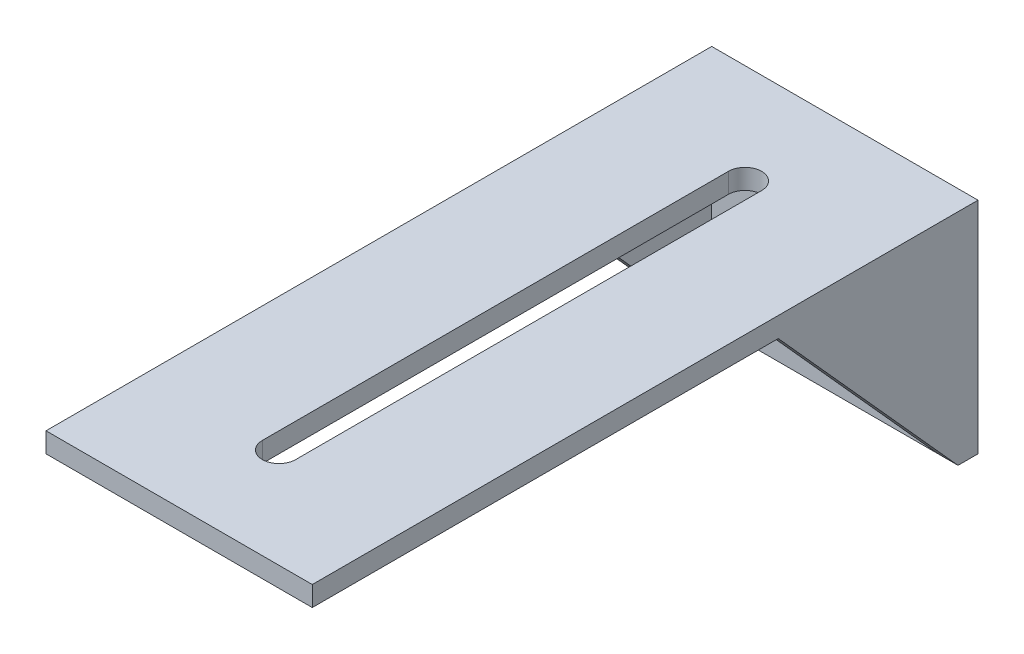
ISO-10303-21;
HEADER;
FILE_DESCRIPTION(('STEP AP214'),'2;1');
FILE_NAME('part.step','',(''),(''),'','','');
FILE_SCHEMA(('AUTOMOTIVE_DESIGN { 1 0 10303 214 1 1 1 1 }'));
ENDSEC;
DATA;
#1=APPLICATION_CONTEXT('core data for automotive mechanical design processes');
#2=APPLICATION_PROTOCOL_DEFINITION('international standard','automotive_design',2000,#1);
#3=PRODUCT_CONTEXT('',#1,'mechanical');
#4=PRODUCT('Part','Part','',(#3));
#5=PRODUCT_RELATED_PRODUCT_CATEGORY('part','',(#4));
#6=PRODUCT_DEFINITION_FORMATION('','',#4);
#7=PRODUCT_DEFINITION_CONTEXT('part definition',#1,'design');
#8=PRODUCT_DEFINITION('design','',#6,#7);
#9=PRODUCT_DEFINITION_SHAPE('','',#8);
#10=(LENGTH_UNIT() NAMED_UNIT(*) SI_UNIT(.MILLI.,.METRE.));
#11=(NAMED_UNIT(*) PLANE_ANGLE_UNIT() SI_UNIT($,.RADIAN.));
#12=(NAMED_UNIT(*) SI_UNIT($,.STERADIAN.) SOLID_ANGLE_UNIT());
#13=UNCERTAINTY_MEASURE_WITH_UNIT(LENGTH_MEASURE(1.E-05),#10,'distance_accuracy_value','');
#14=(GEOMETRIC_REPRESENTATION_CONTEXT(3) GLOBAL_UNCERTAINTY_ASSIGNED_CONTEXT((#13)) GLOBAL_UNIT_ASSIGNED_CONTEXT((#10,
#11,#12)) REPRESENTATION_CONTEXT('',''));
#15=CARTESIAN_POINT('',(0.,0.,0.));
#16=DIRECTION('',(0.,0.,1.));
#17=DIRECTION('',(1.,0.,0.));
#18=AXIS2_PLACEMENT_3D('',#15,#16,#17);
#19=CARTESIAN_POINT('',(0.,3.,0.));
#20=DIRECTION('',(1.,0.,0.));
#21=DIRECTION('',(0.,0.,-1.));
#22=AXIS2_PLACEMENT_3D('',#19,#20,#21);
#23=PLANE('',#22);
#24=DIRECTION('',(0.,-0.743294146247166,-0.66896473162245));
#25=VECTOR('',#24,1.);
#26=CARTESIAN_POINT('',(0.,-13.2596685082873,18.0662983425414));
#27=LINE('',#26,#25);
#28=CARTESIAN_POINT('',(0.,0.,30.));
#29=VERTEX_POINT('',#28);
#30=CARTESIAN_POINT('',(0.,-30.,3.));
#31=VERTEX_POINT('',#30);
#32=EDGE_CURVE('E156',#29,#31,#27,.T.);
#33=ORIENTED_EDGE('',*,*,#32,.F.);
#34=DIRECTION('',(0.,0.,1.));
#35=VECTOR('',#34,1.);
#36=CARTESIAN_POINT('',(0.,0.,0.));
#37=LINE('',#36,#35);
#38=CARTESIAN_POINT('',(0.,0.,100.));
#39=VERTEX_POINT('',#38);
#40=EDGE_CURVE('E200',#29,#39,#37,.T.);
#41=ORIENTED_EDGE('',*,*,#40,.T.);
#42=DIRECTION('',(0.,-1.,0.));
#43=VECTOR('',#42,1.);
#44=CARTESIAN_POINT('',(0.,3.,100.));
#45=LINE('',#44,#43);
#46=CARTESIAN_POINT('',(0.,3.,100.));
#47=VERTEX_POINT('',#46);
#48=EDGE_CURVE('E225',#47,#39,#45,.T.);
#49=ORIENTED_EDGE('',*,*,#48,.F.);
#50=DIRECTION('',(0.,0.,1.));
#51=VECTOR('',#50,1.);
#52=CARTESIAN_POINT('',(0.,3.,0.));
#53=LINE('',#52,#51);
#54=CARTESIAN_POINT('',(0.,3.,0.));
#55=VERTEX_POINT('',#54);
#56=EDGE_CURVE('E201',#55,#47,#53,.T.);
#57=ORIENTED_EDGE('',*,*,#56,.F.);
#58=DIRECTION('',(0.,-1.,0.));
#59=VECTOR('',#58,1.);
#60=CARTESIAN_POINT('',(0.,3.,0.));
#61=LINE('',#60,#59);
#62=CARTESIAN_POINT('',(0.,-30.,0.));
#63=VERTEX_POINT('',#62);
#64=EDGE_CURVE('E209',#55,#63,#61,.T.);
#65=ORIENTED_EDGE('',*,*,#64,.T.);
#66=DIRECTION('',(0.,0.,-1.));
#67=VECTOR('',#66,1.);
#68=CARTESIAN_POINT('',(0.,-30.,0.));
#69=LINE('',#68,#67);
#70=EDGE_CURVE('E167',#31,#63,#69,.T.);
#71=ORIENTED_EDGE('',*,*,#70,.F.);
#72=EDGE_LOOP('',(#33,#41,#49,#57,#65,#71));
#73=FACE_BOUND('',#72,.T.);
#74=ADVANCED_FACE('F33',(#73),#23,.F.);
#75=CARTESIAN_POINT('',(40.,3.,0.));
#76=DIRECTION('',(-1.,0.,0.));
#77=DIRECTION('',(0.,0.,1.));
#78=AXIS2_PLACEMENT_3D('',#75,#76,#77);
#79=PLANE('',#78);
#80=DIRECTION('',(0.,0.743294146247166,0.66896473162245));
#81=VECTOR('',#80,1.);
#82=CARTESIAN_POINT('',(40.,-13.2596685082873,18.0662983425414));
#83=LINE('',#82,#81);
#84=CARTESIAN_POINT('',(40.,-30.,3.));
#85=VERTEX_POINT('',#84);
#86=CARTESIAN_POINT('',(40.,0.,30.));
#87=VERTEX_POINT('',#86);
#88=EDGE_CURVE('E138',#85,#87,#83,.T.);
#89=ORIENTED_EDGE('',*,*,#88,.F.);
#90=DIRECTION('',(0.,0.,1.));
#91=VECTOR('',#90,1.);
#92=CARTESIAN_POINT('',(40.,-30.,0.));
#93=LINE('',#92,#91);
#94=CARTESIAN_POINT('',(40.,-30.,0.));
#95=VERTEX_POINT('',#94);
#96=EDGE_CURVE('E152',#95,#85,#93,.T.);
#97=ORIENTED_EDGE('',*,*,#96,.F.);
#98=DIRECTION('',(0.,-1.,0.));
#99=VECTOR('',#98,1.);
#100=CARTESIAN_POINT('',(40.,3.,0.));
#101=LINE('',#100,#99);
#102=CARTESIAN_POINT('',(40.,3.,0.));
#103=VERTEX_POINT('',#102);
#104=EDGE_CURVE('E234',#103,#95,#101,.T.);
#105=ORIENTED_EDGE('',*,*,#104,.F.);
#106=DIRECTION('',(0.,0.,-1.));
#107=VECTOR('',#106,1.);
#108=CARTESIAN_POINT('',(40.,3.,0.));
#109=LINE('',#108,#107);
#110=CARTESIAN_POINT('',(40.,3.,100.));
#111=VERTEX_POINT('',#110);
#112=EDGE_CURVE('E205',#111,#103,#109,.T.);
#113=ORIENTED_EDGE('',*,*,#112,.F.);
#114=DIRECTION('',(0.,-1.,0.));
#115=VECTOR('',#114,1.);
#116=CARTESIAN_POINT('',(40.,3.,100.));
#117=LINE('',#116,#115);
#118=CARTESIAN_POINT('',(40.,0.,100.));
#119=VERTEX_POINT('',#118);
#120=EDGE_CURVE('E235',#111,#119,#117,.T.);
#121=ORIENTED_EDGE('',*,*,#120,.T.);
#122=DIRECTION('',(0.,0.,-1.));
#123=VECTOR('',#122,1.);
#124=CARTESIAN_POINT('',(40.,0.,0.));
#125=LINE('',#124,#123);
#126=EDGE_CURVE('E155',#119,#87,#125,.T.);
#127=ORIENTED_EDGE('',*,*,#126,.T.);
#128=EDGE_LOOP('',(#89,#97,#105,#113,#121,#127));
#129=FACE_BOUND('',#128,.T.);
#130=ADVANCED_FACE('F150',(#129),#79,.F.);
#131=CARTESIAN_POINT('',(0.,-30.,0.));
#132=DIRECTION('',(0.,1.,0.));
#133=DIRECTION('',(0.,0.,1.));
#134=AXIS2_PLACEMENT_3D('',#131,#132,#133);
#135=PLANE('',#134);
#136=DIRECTION('',(-1.,0.,0.));
#137=VECTOR('',#136,1.);
#138=CARTESIAN_POINT('',(53.,-30.,3.));
#139=LINE('',#138,#137);
#140=CARTESIAN_POINT('',(3.,-30.,3.));
#141=VERTEX_POINT('',#140);
#142=EDGE_CURVE('E145',#141,#31,#139,.T.);
#143=ORIENTED_EDGE('',*,*,#142,.T.);
#144=ORIENTED_EDGE('',*,*,#70,.T.);
#145=DIRECTION('',(1.,0.,0.));
#146=VECTOR('',#145,1.);
#147=CARTESIAN_POINT('',(0.,-30.,0.));
#148=LINE('',#147,#146);
#149=EDGE_CURVE('E161',#63,#95,#148,.T.);
#150=ORIENTED_EDGE('',*,*,#149,.T.);
#151=ORIENTED_EDGE('',*,*,#96,.T.);
#152=CARTESIAN_POINT('',(37.,-30.,3.));
#153=VERTEX_POINT('',#152);
#154=EDGE_CURVE('E135',#85,#153,#139,.T.);
#155=ORIENTED_EDGE('',*,*,#154,.T.);
#156=DIRECTION('',(-1.,0.,0.));
#157=VECTOR('',#156,1.);
#158=CARTESIAN_POINT('',(0.,-30.,3.));
#159=LINE('',#158,#157);
#160=EDGE_CURVE('E163',#153,#141,#159,.T.);
#161=ORIENTED_EDGE('',*,*,#160,.T.);
#162=EDGE_LOOP('',(#143,#144,#150,#151,#155,#161));
#163=FACE_BOUND('',#162,.T.);
#164=ADVANCED_FACE('F159',(#163),#135,.F.);
#165=CARTESIAN_POINT('',(3.,-30.,30.));
#166=DIRECTION('',(1.,0.,0.));
#167=DIRECTION('',(0.,1.,0.));
#168=AXIS2_PLACEMENT_3D('',#165,#166,#167);
#169=PLANE('',#168);
#170=DIRECTION('',(0.,0.,-1.));
#171=VECTOR('',#170,1.);
#172=CARTESIAN_POINT('',(3.,0.,0.));
#173=LINE('',#172,#171);
#174=CARTESIAN_POINT('',(3.,0.,30.));
#175=VERTEX_POINT('',#174);
#176=CARTESIAN_POINT('',(3.,0.,7.99999999999999));
#177=VERTEX_POINT('',#176);
#178=EDGE_CURVE('E254',#175,#177,#173,.T.);
#179=ORIENTED_EDGE('',*,*,#178,.F.);
#180=DIRECTION('',(0.,-0.743294146247166,-0.66896473162245));
#181=VECTOR('',#180,1.);
#182=CARTESIAN_POINT('',(3.,-16.5745856353591,15.0828729281768));
#183=LINE('',#182,#181);
#184=EDGE_CURVE('E144',#175,#141,#183,.T.);
#185=ORIENTED_EDGE('',*,*,#184,.T.);
#186=DIRECTION('',(0.,-1.,0.));
#187=VECTOR('',#186,1.);
#188=CARTESIAN_POINT('',(3.,-30.,3.));
#189=LINE('',#188,#187);
#190=CARTESIAN_POINT('',(3.,-5.00000000000003,3.));
#191=VERTEX_POINT('',#190);
#192=EDGE_CURVE('E252',#191,#141,#189,.T.);
#193=ORIENTED_EDGE('',*,*,#192,.F.);
#194=DIRECTION('',(0.,0.707106781186551,0.707106781186545));
#195=VECTOR('',#194,1.);
#196=CARTESIAN_POINT('',(3.,-5.00000000000003,3.));
#197=LINE('',#196,#195);
#198=EDGE_CURVE('E216',#177,#191,#197,.F.);
#199=ORIENTED_EDGE('',*,*,#198,.F.);
#200=EDGE_LOOP('',(#179,#185,#193,#199));
#201=FACE_BOUND('',#200,.T.);
#202=ADVANCED_FACE('F370',(#201),#169,.T.);
#203=CARTESIAN_POINT('',(37.,3.,30.));
#204=DIRECTION('',(-1.,0.,0.));
#205=DIRECTION('',(0.,-1.,0.));
#206=AXIS2_PLACEMENT_3D('',#203,#204,#205);
#207=PLANE('',#206);
#208=DIRECTION('',(0.,1.,0.));
#209=VECTOR('',#208,1.);
#210=CARTESIAN_POINT('',(37.,-30.,3.));
#211=LINE('',#210,#209);
#212=CARTESIAN_POINT('',(37.,-5.00000000000003,3.));
#213=VERTEX_POINT('',#212);
#214=EDGE_CURVE('E256',#153,#213,#211,.T.);
#215=ORIENTED_EDGE('',*,*,#214,.F.);
#216=DIRECTION('',(0.,0.743294146247166,0.66896473162245));
#217=VECTOR('',#216,1.);
#218=CARTESIAN_POINT('',(37.,1.65745856353591,31.4917127071823));
#219=LINE('',#218,#217);
#220=CARTESIAN_POINT('',(37.,0.,30.));
#221=VERTEX_POINT('',#220);
#222=EDGE_CURVE('E11',#153,#221,#219,.T.);
#223=ORIENTED_EDGE('',*,*,#222,.T.);
#224=DIRECTION('',(0.,0.,1.));
#225=VECTOR('',#224,1.);
#226=CARTESIAN_POINT('',(37.,0.,0.));
#227=LINE('',#226,#225);
#228=CARTESIAN_POINT('',(37.,0.,7.99999999999999));
#229=VERTEX_POINT('',#228);
#230=EDGE_CURVE('E47',#229,#221,#227,.T.);
#231=ORIENTED_EDGE('',*,*,#230,.F.);
#232=DIRECTION('',(0.,-0.707106781186551,-0.707106781186545));
#233=VECTOR('',#232,1.);
#234=CARTESIAN_POINT('',(37.,-5.00000000000004,3.));
#235=LINE('',#234,#233);
#236=EDGE_CURVE('E41',#213,#229,#235,.F.);
#237=ORIENTED_EDGE('',*,*,#236,.F.);
#238=EDGE_LOOP('',(#215,#223,#231,#237));
#239=FACE_BOUND('',#238,.T.);
#240=ADVANCED_FACE('F312',(#239),#207,.T.);
#241=CARTESIAN_POINT('',(0.,0.,0.));
#242=DIRECTION('',(0.,1.,0.));
#243=DIRECTION('',(0.,0.,1.));
#244=AXIS2_PLACEMENT_3D('',#241,#242,#243);
#245=PLANE('',#244);
#246=DIRECTION('',(0.,0.,1.));
#247=VECTOR('',#246,1.);
#248=CARTESIAN_POINT('',(17.5,0.,85.));
#249=LINE('',#248,#247);
#250=CARTESIAN_POINT('',(17.5,0.,15.));
#251=VERTEX_POINT('',#250);
#252=CARTESIAN_POINT('',(17.5,0.,85.));
#253=VERTEX_POINT('',#252);
#254=EDGE_CURVE('E174',#251,#253,#249,.T.);
#255=ORIENTED_EDGE('',*,*,#254,.T.);
#256=CARTESIAN_POINT('',(20.,0.,85.));
#257=DIRECTION('',(0.,1.,0.));
#258=DIRECTION('',(0.,0.,1.));
#259=AXIS2_PLACEMENT_3D('',#256,#257,#258);
#260=CIRCLE('',#259,2.5);
#261=CARTESIAN_POINT('',(22.5,0.,85.));
#262=VERTEX_POINT('',#261);
#263=EDGE_CURVE('E165',#253,#262,#260,.T.);
#264=ORIENTED_EDGE('',*,*,#263,.T.);
#265=DIRECTION('',(0.,0.,-1.));
#266=VECTOR('',#265,1.);
#267=CARTESIAN_POINT('',(22.5,0.,85.));
#268=LINE('',#267,#266);
#269=CARTESIAN_POINT('',(22.5,0.,15.));
#270=VERTEX_POINT('',#269);
#271=EDGE_CURVE('E184',#262,#270,#268,.T.);
#272=ORIENTED_EDGE('',*,*,#271,.T.);
#273=CARTESIAN_POINT('',(20.,0.,15.));
#274=DIRECTION('',(0.,1.,0.));
#275=DIRECTION('',(0.,0.,1.));
#276=AXIS2_PLACEMENT_3D('',#273,#274,#275);
#277=CIRCLE('',#276,2.5);
#278=EDGE_CURVE('E186',#270,#251,#277,.T.);
#279=ORIENTED_EDGE('',*,*,#278,.T.);
#280=EDGE_LOOP('',(#255,#264,#272,#279));
#281=FACE_BOUND('',#280,.T.);
#282=DIRECTION('',(-1.,0.,0.));
#283=VECTOR('',#282,1.);
#284=CARTESIAN_POINT('',(0.,0.,30.));
#285=LINE('',#284,#283);
#286=EDGE_CURVE('E261',#175,#29,#285,.T.);
#287=ORIENTED_EDGE('',*,*,#286,.F.);
#288=ORIENTED_EDGE('',*,*,#178,.T.);
#289=DIRECTION('',(1.,0.,0.));
#290=VECTOR('',#289,1.);
#291=CARTESIAN_POINT('',(40.,0.,7.99999999999999));
#292=LINE('',#291,#290);
#293=EDGE_CURVE('E222',#177,#229,#292,.T.);
#294=ORIENTED_EDGE('',*,*,#293,.T.);
#295=ORIENTED_EDGE('',*,*,#230,.T.);
#296=DIRECTION('',(-1.,0.,0.));
#297=VECTOR('',#296,1.);
#298=CARTESIAN_POINT('',(0.,0.,30.));
#299=LINE('',#298,#297);
#300=EDGE_CURVE('E251',#87,#221,#299,.T.);
#301=ORIENTED_EDGE('',*,*,#300,.F.);
#302=ORIENTED_EDGE('',*,*,#126,.F.);
#303=DIRECTION('',(1.,0.,0.));
#304=VECTOR('',#303,1.);
#305=CARTESIAN_POINT('',(0.,0.,100.));
#306=LINE('',#305,#304);
#307=EDGE_CURVE('E212',#39,#119,#306,.T.);
#308=ORIENTED_EDGE('',*,*,#307,.F.);
#309=ORIENTED_EDGE('',*,*,#40,.F.);
#310=EDGE_LOOP('',(#287,#288,#294,#295,#301,#302,#308,#309));
#311=FACE_BOUND('',#310,.T.);
#312=ADVANCED_FACE('F250',(#281,#311),#245,.F.);
#313=CARTESIAN_POINT('',(0.,3.,0.));
#314=DIRECTION('',(0.,1.,0.));
#315=DIRECTION('',(0.,0.,1.));
#316=AXIS2_PLACEMENT_3D('',#313,#314,#315);
#317=PLANE('',#316);
#318=DIRECTION('',(-1.,0.,0.));
#319=VECTOR('',#318,1.);
#320=CARTESIAN_POINT('',(0.,3.,0.));
#321=LINE('',#320,#319);
#322=EDGE_CURVE('E207',#103,#55,#321,.T.);
#323=ORIENTED_EDGE('',*,*,#322,.T.);
#324=ORIENTED_EDGE('',*,*,#56,.T.);
#325=DIRECTION('',(1.,0.,0.));
#326=VECTOR('',#325,1.);
#327=CARTESIAN_POINT('',(0.,3.,100.));
#328=LINE('',#327,#326);
#329=EDGE_CURVE('E203',#47,#111,#328,.T.);
#330=ORIENTED_EDGE('',*,*,#329,.T.);
#331=ORIENTED_EDGE('',*,*,#112,.T.);
#332=EDGE_LOOP('',(#323,#324,#330,#331));
#333=FACE_BOUND('',#332,.T.);
#334=DIRECTION('',(0.,0.,-1.));
#335=VECTOR('',#334,1.);
#336=CARTESIAN_POINT('',(22.5,3.,85.));
#337=LINE('',#336,#335);
#338=CARTESIAN_POINT('',(22.5,3.,85.));
#339=VERTEX_POINT('',#338);
#340=CARTESIAN_POINT('',(22.5,3.,15.));
#341=VERTEX_POINT('',#340);
#342=EDGE_CURVE('E173',#339,#341,#337,.T.);
#343=ORIENTED_EDGE('',*,*,#342,.F.);
#344=CARTESIAN_POINT('',(20.,3.,85.));
#345=DIRECTION('',(0.,1.,0.));
#346=DIRECTION('',(0.,0.,1.));
#347=AXIS2_PLACEMENT_3D('',#344,#345,#346);
#348=CIRCLE('',#347,2.5);
#349=CARTESIAN_POINT('',(17.5,3.,85.));
#350=VERTEX_POINT('',#349);
#351=EDGE_CURVE('E171',#350,#339,#348,.T.);
#352=ORIENTED_EDGE('',*,*,#351,.F.);
#353=DIRECTION('',(0.,0.,1.));
#354=VECTOR('',#353,1.);
#355=CARTESIAN_POINT('',(17.5,3.,85.));
#356=LINE('',#355,#354);
#357=CARTESIAN_POINT('',(17.5,3.,15.));
#358=VERTEX_POINT('',#357);
#359=EDGE_CURVE('E179',#358,#350,#356,.T.);
#360=ORIENTED_EDGE('',*,*,#359,.F.);
#361=CARTESIAN_POINT('',(20.,3.,15.));
#362=DIRECTION('',(0.,1.,0.));
#363=DIRECTION('',(0.,0.,1.));
#364=AXIS2_PLACEMENT_3D('',#361,#362,#363);
#365=CIRCLE('',#364,2.5);
#366=EDGE_CURVE('E176',#341,#358,#365,.T.);
#367=ORIENTED_EDGE('',*,*,#366,.F.);
#368=EDGE_LOOP('',(#343,#352,#360,#367));
#369=FACE_BOUND('',#368,.T.);
#370=ADVANCED_FACE('F267',(#333,#369),#317,.T.);
#371=CARTESIAN_POINT('',(0.,3.,100.));
#372=DIRECTION('',(0.,0.,-1.));
#373=DIRECTION('',(-1.,0.,0.));
#374=AXIS2_PLACEMENT_3D('',#371,#372,#373);
#375=PLANE('',#374);
#376=ORIENTED_EDGE('',*,*,#307,.T.);
#377=ORIENTED_EDGE('',*,*,#120,.F.);
#378=ORIENTED_EDGE('',*,*,#329,.F.);
#379=ORIENTED_EDGE('',*,*,#48,.T.);
#380=EDGE_LOOP('',(#376,#377,#378,#379));
#381=FACE_BOUND('',#380,.T.);
#382=ADVANCED_FACE('F242',(#381),#375,.F.);
#383=CARTESIAN_POINT('',(0.,3.,0.));
#384=DIRECTION('',(0.,0.,1.));
#385=DIRECTION('',(1.,0.,0.));
#386=AXIS2_PLACEMENT_3D('',#383,#384,#385);
#387=PLANE('',#386);
#388=CARTESIAN_POINT('',(20.,-16.495296504047,0.));
#389=DIRECTION('',(0.,0.,1.));
#390=DIRECTION('',(1.,0.,0.));
#391=AXIS2_PLACEMENT_3D('',#388,#389,#390);
#392=CIRCLE('',#391,1.75);
#393=CARTESIAN_POINT('',(21.75,-16.495296504047,0.));
#394=VERTEX_POINT('',#393);
#395=EDGE_CURVE('E443',#394,#394,#392,.T.);
#396=ORIENTED_EDGE('',*,*,#395,.T.);
#397=EDGE_LOOP('',(#396));
#398=FACE_BOUND('',#397,.T.);
#399=ORIENTED_EDGE('',*,*,#64,.F.);
#400=ORIENTED_EDGE('',*,*,#322,.F.);
#401=ORIENTED_EDGE('',*,*,#104,.T.);
#402=ORIENTED_EDGE('',*,*,#149,.F.);
#403=EDGE_LOOP('',(#399,#400,#401,#402));
#404=FACE_BOUND('',#403,.T.);
#405=ADVANCED_FACE('F265',(#398,#404),#387,.F.);
#406=CARTESIAN_POINT('',(20.,3.,85.));
#407=DIRECTION('',(0.,-1.,0.));
#408=DIRECTION('',(0.,0.,-1.));
#409=AXIS2_PLACEMENT_3D('',#406,#407,#408);
#410=CYLINDRICAL_SURFACE('',#409,2.5);
#411=ORIENTED_EDGE('',*,*,#263,.F.);
#412=DIRECTION('',(0.,-1.,0.));
#413=VECTOR('',#412,1.);
#414=CARTESIAN_POINT('',(17.5,3.,85.));
#415=LINE('',#414,#413);
#416=EDGE_CURVE('E181',#350,#253,#415,.T.);
#417=ORIENTED_EDGE('',*,*,#416,.F.);
#418=ORIENTED_EDGE('',*,*,#351,.T.);
#419=DIRECTION('',(0.,-1.,0.));
#420=VECTOR('',#419,1.);
#421=CARTESIAN_POINT('',(22.5,3.,85.));
#422=LINE('',#421,#420);
#423=EDGE_CURVE('E197',#339,#262,#422,.T.);
#424=ORIENTED_EDGE('',*,*,#423,.T.);
#425=EDGE_LOOP('',(#411,#417,#418,#424));
#426=FACE_BOUND('',#425,.T.);
#427=ADVANCED_FACE('F286',(#426),#410,.F.);
#428=CARTESIAN_POINT('',(22.5,3.,85.));
#429=DIRECTION('',(-1.,0.,0.));
#430=DIRECTION('',(0.,0.,1.));
#431=AXIS2_PLACEMENT_3D('',#428,#429,#430);
#432=PLANE('',#431);
#433=ORIENTED_EDGE('',*,*,#271,.F.);
#434=ORIENTED_EDGE('',*,*,#423,.F.);
#435=ORIENTED_EDGE('',*,*,#342,.T.);
#436=DIRECTION('',(0.,-1.,0.));
#437=VECTOR('',#436,1.);
#438=CARTESIAN_POINT('',(22.5,3.,15.));
#439=LINE('',#438,#437);
#440=EDGE_CURVE('E194',#341,#270,#439,.T.);
#441=ORIENTED_EDGE('',*,*,#440,.T.);
#442=EDGE_LOOP('',(#433,#434,#435,#441));
#443=FACE_BOUND('',#442,.T.);
#444=ADVANCED_FACE('F278',(#443),#432,.T.);
#445=CARTESIAN_POINT('',(20.,3.,15.));
#446=DIRECTION('',(0.,-1.,0.));
#447=DIRECTION('',(0.,0.,-1.));
#448=AXIS2_PLACEMENT_3D('',#445,#446,#447);
#449=CYLINDRICAL_SURFACE('',#448,2.5);
#450=ORIENTED_EDGE('',*,*,#278,.F.);
#451=ORIENTED_EDGE('',*,*,#440,.F.);
#452=ORIENTED_EDGE('',*,*,#366,.T.);
#453=DIRECTION('',(0.,-1.,0.));
#454=VECTOR('',#453,1.);
#455=CARTESIAN_POINT('',(17.5,3.,15.));
#456=LINE('',#455,#454);
#457=EDGE_CURVE('E192',#358,#251,#456,.T.);
#458=ORIENTED_EDGE('',*,*,#457,.T.);
#459=EDGE_LOOP('',(#450,#451,#452,#458));
#460=FACE_BOUND('',#459,.T.);
#461=ADVANCED_FACE('F281',(#460),#449,.F.);
#462=CARTESIAN_POINT('',(17.5,3.,85.));
#463=DIRECTION('',(1.,0.,0.));
#464=DIRECTION('',(0.,0.,-1.));
#465=AXIS2_PLACEMENT_3D('',#462,#463,#464);
#466=PLANE('',#465);
#467=ORIENTED_EDGE('',*,*,#254,.F.);
#468=ORIENTED_EDGE('',*,*,#457,.F.);
#469=ORIENTED_EDGE('',*,*,#359,.T.);
#470=ORIENTED_EDGE('',*,*,#416,.T.);
#471=EDGE_LOOP('',(#467,#468,#469,#470));
#472=FACE_BOUND('',#471,.T.);
#473=ADVANCED_FACE('F289',(#472),#466,.T.);
#474=CARTESIAN_POINT('',(0.,-30.,3.));
#475=DIRECTION('',(0.,0.,-1.));
#476=DIRECTION('',(-1.,0.,0.));
#477=AXIS2_PLACEMENT_3D('',#474,#475,#476);
#478=PLANE('',#477);
#479=CARTESIAN_POINT('',(20.,-16.495296504047,3.));
#480=DIRECTION('',(0.,0.,1.));
#481=DIRECTION('',(1.,0.,0.));
#482=AXIS2_PLACEMENT_3D('',#479,#480,#481);
#483=CIRCLE('',#482,1.75);
#484=CARTESIAN_POINT('',(21.75,-16.495296504047,3.));
#485=VERTEX_POINT('',#484);
#486=EDGE_CURVE('E446',#485,#485,#483,.T.);
#487=ORIENTED_EDGE('',*,*,#486,.F.);
#488=EDGE_LOOP('',(#487));
#489=FACE_BOUND('',#488,.T.);
#490=ORIENTED_EDGE('',*,*,#160,.F.);
#491=ORIENTED_EDGE('',*,*,#214,.T.);
#492=DIRECTION('',(-1.,0.,0.));
#493=VECTOR('',#492,1.);
#494=CARTESIAN_POINT('',(0.,-5.00000000000003,3.));
#495=LINE('',#494,#493);
#496=EDGE_CURVE('E55',#213,#191,#495,.T.);
#497=ORIENTED_EDGE('',*,*,#496,.T.);
#498=ORIENTED_EDGE('',*,*,#192,.T.);
#499=EDGE_LOOP('',(#490,#491,#497,#498));
#500=FACE_BOUND('',#499,.T.);
#501=ADVANCED_FACE('F291',(#489,#500),#478,.F.);
#502=CARTESIAN_POINT('',(0.,-5.00000000000003,3.));
#503=DIRECTION('',(0.,-0.707106781186545,0.707106781186551));
#504=DIRECTION('',(1.,0.,0.));
#505=AXIS2_PLACEMENT_3D('',#502,#503,#504);
#506=PLANE('',#505);
#507=ORIENTED_EDGE('',*,*,#496,.F.);
#508=ORIENTED_EDGE('',*,*,#236,.T.);
#509=ORIENTED_EDGE('',*,*,#293,.F.);
#510=ORIENTED_EDGE('',*,*,#198,.T.);
#511=EDGE_LOOP('',(#507,#508,#509,#510));
#512=FACE_BOUND('',#511,.T.);
#513=ADVANCED_FACE('F35',(#512),#506,.T.);
#514=CARTESIAN_POINT('',(53.,0.,30.));
#515=DIRECTION('',(0.,-0.66896473162245,0.743294146247166));
#516=DIRECTION('',(0.,-0.743294146247166,-0.66896473162245));
#517=AXIS2_PLACEMENT_3D('',#514,#515,#516);
#518=PLANE('',#517);
#519=ORIENTED_EDGE('',*,*,#88,.T.);
#520=ORIENTED_EDGE('',*,*,#300,.T.);
#521=ORIENTED_EDGE('',*,*,#222,.F.);
#522=ORIENTED_EDGE('',*,*,#154,.F.);
#523=EDGE_LOOP('',(#519,#520,#521,#522));
#524=FACE_BOUND('',#523,.T.);
#525=ADVANCED_FACE('F137',(#524),#518,.T.);
#526=ORIENTED_EDGE('',*,*,#32,.T.);
#527=ORIENTED_EDGE('',*,*,#142,.F.);
#528=ORIENTED_EDGE('',*,*,#184,.F.);
#529=ORIENTED_EDGE('',*,*,#286,.T.);
#530=EDGE_LOOP('',(#526,#527,#528,#529));
#531=FACE_BOUND('',#530,.T.);
#532=ADVANCED_FACE('F419',(#531),#518,.T.);
#533=CARTESIAN_POINT('',(20.,-16.495296504047,-27.));
#534=DIRECTION('',(0.,0.,1.));
#535=DIRECTION('',(1.,0.,0.));
#536=AXIS2_PLACEMENT_3D('',#533,#534,#535);
#537=CYLINDRICAL_SURFACE('',#536,1.75);
#538=ORIENTED_EDGE('',*,*,#486,.T.);
#539=EDGE_LOOP('',(#538));
#540=FACE_BOUND('',#539,.T.);
#541=ORIENTED_EDGE('',*,*,#395,.F.);
#542=EDGE_LOOP('',(#541));
#543=FACE_BOUND('',#542,.T.);
#544=ADVANCED_FACE('F415',(#540,#543),#537,.F.);
#545=CLOSED_SHELL('',(#74,#130,#164,#202,#240,#312,#370,#382,#405,#427,#444,#461,#473,#501,#513,
#525,#532,#544));
#546=MANIFOLD_SOLID_BREP('B2',#545);
#547=ADVANCED_BREP_SHAPE_REPRESENTATION('',(#18,#546),#14);
#548=SHAPE_DEFINITION_REPRESENTATION(#9,#547);
ENDSEC;
END-ISO-10303-21;
